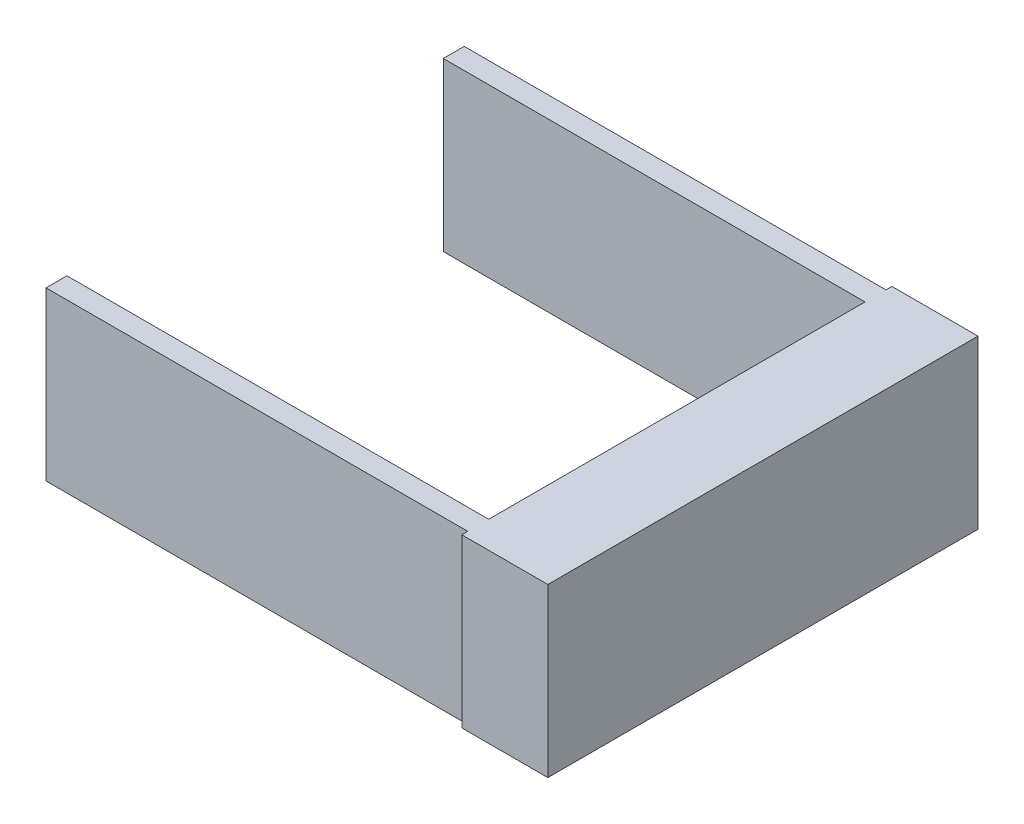
ISO-10303-21;
HEADER;
FILE_DESCRIPTION(('STEP AP214'),'2;1');
FILE_NAME('part.step','',(''),(''),'','','');
FILE_SCHEMA(('AUTOMOTIVE_DESIGN { 1 0 10303 214 1 1 1 1 }'));
ENDSEC;
DATA;
#1=APPLICATION_CONTEXT('core data for automotive mechanical design processes');
#2=APPLICATION_PROTOCOL_DEFINITION('international standard','automotive_design',2000,#1);
#3=PRODUCT_CONTEXT('',#1,'mechanical');
#4=PRODUCT('Part','Part','',(#3));
#5=PRODUCT_RELATED_PRODUCT_CATEGORY('part','',(#4));
#6=PRODUCT_DEFINITION_FORMATION('','',#4);
#7=PRODUCT_DEFINITION_CONTEXT('part definition',#1,'design');
#8=PRODUCT_DEFINITION('design','',#6,#7);
#9=PRODUCT_DEFINITION_SHAPE('','',#8);
#10=(LENGTH_UNIT() NAMED_UNIT(*) SI_UNIT(.MILLI.,.METRE.));
#11=(NAMED_UNIT(*) PLANE_ANGLE_UNIT() SI_UNIT($,.RADIAN.));
#12=(NAMED_UNIT(*) SI_UNIT($,.STERADIAN.) SOLID_ANGLE_UNIT());
#13=UNCERTAINTY_MEASURE_WITH_UNIT(LENGTH_MEASURE(1.E-05),#10,'distance_accuracy_value','');
#14=(GEOMETRIC_REPRESENTATION_CONTEXT(3) GLOBAL_UNCERTAINTY_ASSIGNED_CONTEXT((#13)) GLOBAL_UNIT_ASSIGNED_CONTEXT((#10,
#11,#12)) REPRESENTATION_CONTEXT('',''));
#15=CARTESIAN_POINT('',(0.,0.,0.));
#16=DIRECTION('',(0.,0.,1.));
#17=DIRECTION('',(1.,0.,0.));
#18=AXIS2_PLACEMENT_3D('',#15,#16,#17);
#19=CARTESIAN_POINT('',(0.,28.,35.));
#20=DIRECTION('',(0.,0.,-1.));
#21=DIRECTION('',(-1.,0.,0.));
#22=AXIS2_PLACEMENT_3D('',#19,#20,#21);
#23=PLANE('',#22);
#24=DIRECTION('',(1.,0.,0.));
#25=VECTOR('',#24,1.);
#26=CARTESIAN_POINT('',(0.,0.,35.));
#27=LINE('',#26,#25);
#28=CARTESIAN_POINT('',(-50.,0.,35.));
#29=VERTEX_POINT('',#28);
#30=CARTESIAN_POINT('',(20.5945089595884,0.,35.));
#31=VERTEX_POINT('',#30);
#32=EDGE_CURVE('E158',#29,#31,#27,.T.);
#33=ORIENTED_EDGE('',*,*,#32,.T.);
#34=DIRECTION('',(0.,-1.,0.));
#35=VECTOR('',#34,1.);
#36=CARTESIAN_POINT('',(20.5945089595884,28.,35.));
#37=LINE('',#36,#35);
#38=CARTESIAN_POINT('',(20.5945089595884,28.,35.));
#39=VERTEX_POINT('',#38);
#40=EDGE_CURVE('E11',#39,#31,#37,.T.);
#41=ORIENTED_EDGE('',*,*,#40,.F.);
#42=DIRECTION('',(1.,0.,0.));
#43=VECTOR('',#42,1.);
#44=CARTESIAN_POINT('',(0.,28.,35.));
#45=LINE('',#44,#43);
#46=CARTESIAN_POINT('',(-50.,28.,35.));
#47=VERTEX_POINT('',#46);
#48=EDGE_CURVE('E186',#47,#39,#45,.T.);
#49=ORIENTED_EDGE('',*,*,#48,.F.);
#50=DIRECTION('',(0.,-1.,0.));
#51=VECTOR('',#50,1.);
#52=CARTESIAN_POINT('',(-50.,28.,35.));
#53=LINE('',#52,#51);
#54=EDGE_CURVE('E154',#47,#29,#53,.T.);
#55=ORIENTED_EDGE('',*,*,#54,.T.);
#56=EDGE_LOOP('',(#33,#41,#49,#55));
#57=FACE_BOUND('',#56,.T.);
#58=ADVANCED_FACE('F39',(#57),#23,.F.);
#59=CARTESIAN_POINT('',(20.5945089595884,28.,0.));
#60=DIRECTION('',(1.,0.,0.));
#61=DIRECTION('',(0.,0.,-1.));
#62=AXIS2_PLACEMENT_3D('',#59,#60,#61);
#63=PLANE('',#62);
#64=DIRECTION('',(0.,0.,1.));
#65=VECTOR('',#64,1.);
#66=CARTESIAN_POINT('',(20.5945089595884,0.,0.));
#67=LINE('',#66,#65);
#68=CARTESIAN_POINT('',(20.5945089595884,0.,36.));
#69=VERTEX_POINT('',#68);
#70=EDGE_CURVE('E161',#31,#69,#67,.T.);
#71=ORIENTED_EDGE('',*,*,#70,.T.);
#72=DIRECTION('',(0.,-1.,0.));
#73=VECTOR('',#72,1.);
#74=CARTESIAN_POINT('',(20.5945089595884,28.,36.));
#75=LINE('',#74,#73);
#76=CARTESIAN_POINT('',(20.5945089595884,28.,36.));
#77=VERTEX_POINT('',#76);
#78=EDGE_CURVE('E47',#77,#69,#75,.T.);
#79=ORIENTED_EDGE('',*,*,#78,.F.);
#80=DIRECTION('',(0.,0.,1.));
#81=VECTOR('',#80,1.);
#82=CARTESIAN_POINT('',(20.5945089595884,28.,0.));
#83=LINE('',#82,#81);
#84=EDGE_CURVE('E106',#39,#77,#83,.T.);
#85=ORIENTED_EDGE('',*,*,#84,.F.);
#86=ORIENTED_EDGE('',*,*,#40,.T.);
#87=EDGE_LOOP('',(#71,#79,#85,#86));
#88=FACE_BOUND('',#87,.T.);
#89=ADVANCED_FACE('F209',(#88),#63,.F.);
#90=CARTESIAN_POINT('',(0.,28.,36.));
#91=DIRECTION('',(0.,0.,1.));
#92=DIRECTION('',(1.,0.,0.));
#93=AXIS2_PLACEMENT_3D('',#90,#91,#92);
#94=PLANE('',#93);
#95=DIRECTION('',(-1.,0.,0.));
#96=VECTOR('',#95,1.);
#97=CARTESIAN_POINT('',(0.,0.,36.));
#98=LINE('',#97,#96);
#99=CARTESIAN_POINT('',(35.,0.,36.));
#100=VERTEX_POINT('',#99);
#101=EDGE_CURVE('E164',#100,#69,#98,.T.);
#102=ORIENTED_EDGE('',*,*,#101,.F.);
#103=DIRECTION('',(0.,-1.,0.));
#104=VECTOR('',#103,1.);
#105=CARTESIAN_POINT('',(35.,28.,36.));
#106=LINE('',#105,#104);
#107=CARTESIAN_POINT('',(35.,28.,36.));
#108=VERTEX_POINT('',#107);
#109=EDGE_CURVE('E202',#108,#100,#106,.T.);
#110=ORIENTED_EDGE('',*,*,#109,.F.);
#111=DIRECTION('',(-1.,0.,0.));
#112=VECTOR('',#111,1.);
#113=CARTESIAN_POINT('',(0.,28.,36.));
#114=LINE('',#113,#112);
#115=EDGE_CURVE('E208',#108,#77,#114,.T.);
#116=ORIENTED_EDGE('',*,*,#115,.T.);
#117=ORIENTED_EDGE('',*,*,#78,.T.);
#118=EDGE_LOOP('',(#102,#110,#116,#117));
#119=FACE_BOUND('',#118,.T.);
#120=ADVANCED_FACE('F206',(#119),#94,.T.);
#121=CARTESIAN_POINT('',(35.,28.,0.));
#122=DIRECTION('',(1.,0.,0.));
#123=DIRECTION('',(0.,0.,-1.));
#124=AXIS2_PLACEMENT_3D('',#121,#122,#123);
#125=PLANE('',#124);
#126=DIRECTION('',(0.,0.,1.));
#127=VECTOR('',#126,1.);
#128=CARTESIAN_POINT('',(35.,0.,0.));
#129=LINE('',#128,#127);
#130=CARTESIAN_POINT('',(35.,0.,-36.));
#131=VERTEX_POINT('',#130);
#132=EDGE_CURVE('E167',#131,#100,#129,.T.);
#133=ORIENTED_EDGE('',*,*,#132,.F.);
#134=DIRECTION('',(0.,-1.,0.));
#135=VECTOR('',#134,1.);
#136=CARTESIAN_POINT('',(35.,28.,-36.));
#137=LINE('',#136,#135);
#138=CARTESIAN_POINT('',(35.,28.,-36.));
#139=VERTEX_POINT('',#138);
#140=EDGE_CURVE('E200',#139,#131,#137,.T.);
#141=ORIENTED_EDGE('',*,*,#140,.F.);
#142=DIRECTION('',(0.,0.,1.));
#143=VECTOR('',#142,1.);
#144=CARTESIAN_POINT('',(35.,28.,0.));
#145=LINE('',#144,#143);
#146=EDGE_CURVE('E222',#139,#108,#145,.T.);
#147=ORIENTED_EDGE('',*,*,#146,.T.);
#148=ORIENTED_EDGE('',*,*,#109,.T.);
#149=EDGE_LOOP('',(#133,#141,#147,#148));
#150=FACE_BOUND('',#149,.T.);
#151=ADVANCED_FACE('F218',(#150),#125,.T.);
#152=CARTESIAN_POINT('',(0.,28.,-36.));
#153=DIRECTION('',(0.,0.,1.));
#154=DIRECTION('',(1.,0.,0.));
#155=AXIS2_PLACEMENT_3D('',#152,#153,#154);
#156=PLANE('',#155);
#157=DIRECTION('',(-1.,0.,0.));
#158=VECTOR('',#157,1.);
#159=CARTESIAN_POINT('',(0.,0.,-36.));
#160=LINE('',#159,#158);
#161=CARTESIAN_POINT('',(20.5945089595884,0.,-36.));
#162=VERTEX_POINT('',#161);
#163=EDGE_CURVE('E170',#131,#162,#160,.T.);
#164=ORIENTED_EDGE('',*,*,#163,.T.);
#165=DIRECTION('',(0.,-1.,0.));
#166=VECTOR('',#165,1.);
#167=CARTESIAN_POINT('',(20.5945089595884,28.,-36.));
#168=LINE('',#167,#166);
#169=CARTESIAN_POINT('',(20.5945089595884,28.,-36.));
#170=VERTEX_POINT('',#169);
#171=EDGE_CURVE('E197',#170,#162,#168,.T.);
#172=ORIENTED_EDGE('',*,*,#171,.F.);
#173=DIRECTION('',(-1.,0.,0.));
#174=VECTOR('',#173,1.);
#175=CARTESIAN_POINT('',(0.,28.,-36.));
#176=LINE('',#175,#174);
#177=EDGE_CURVE('E224',#139,#170,#176,.T.);
#178=ORIENTED_EDGE('',*,*,#177,.F.);
#179=ORIENTED_EDGE('',*,*,#140,.T.);
#180=EDGE_LOOP('',(#164,#172,#178,#179));
#181=FACE_BOUND('',#180,.T.);
#182=ADVANCED_FACE('F268',(#181),#156,.F.);
#183=CARTESIAN_POINT('',(20.5945089595832,28.,3.00096536614594E-12));
#184=DIRECTION('',(1.,0.,1.45716771982054E-13));
#185=DIRECTION('',(1.45716771982054E-13,0.,-1.));
#186=AXIS2_PLACEMENT_3D('',#183,#184,#185);
#187=PLANE('',#186);
#188=DIRECTION('',(-1.45716771982054E-13,0.,1.));
#189=VECTOR('',#188,1.);
#190=CARTESIAN_POINT('',(20.5945089595832,0.,3.00096536614594E-12));
#191=LINE('',#190,#189);
#192=CARTESIAN_POINT('',(20.5945089595883,0.,-35.));
#193=VERTEX_POINT('',#192);
#194=EDGE_CURVE('E172',#162,#193,#191,.T.);
#195=ORIENTED_EDGE('',*,*,#194,.T.);
#196=DIRECTION('',(0.,-1.,0.));
#197=VECTOR('',#196,1.);
#198=CARTESIAN_POINT('',(20.5945089595883,28.,-35.));
#199=LINE('',#198,#197);
#200=CARTESIAN_POINT('',(20.5945089595883,28.,-35.));
#201=VERTEX_POINT('',#200);
#202=EDGE_CURVE('E195',#201,#193,#199,.T.);
#203=ORIENTED_EDGE('',*,*,#202,.F.);
#204=DIRECTION('',(-1.45716771982054E-13,0.,1.));
#205=VECTOR('',#204,1.);
#206=CARTESIAN_POINT('',(20.5945089595832,28.,3.00096536614594E-12));
#207=LINE('',#206,#205);
#208=EDGE_CURVE('E230',#170,#201,#207,.T.);
#209=ORIENTED_EDGE('',*,*,#208,.F.);
#210=ORIENTED_EDGE('',*,*,#171,.T.);
#211=EDGE_LOOP('',(#195,#203,#209,#210));
#212=FACE_BOUND('',#211,.T.);
#213=ADVANCED_FACE('F271',(#212),#187,.F.);
#214=CARTESIAN_POINT('',(0.,28.,-35.));
#215=DIRECTION('',(0.,0.,-1.));
#216=DIRECTION('',(-1.,0.,0.));
#217=AXIS2_PLACEMENT_3D('',#214,#215,#216);
#218=PLANE('',#217);
#219=DIRECTION('',(1.,0.,0.));
#220=VECTOR('',#219,1.);
#221=CARTESIAN_POINT('',(0.,0.,-35.));
#222=LINE('',#221,#220);
#223=CARTESIAN_POINT('',(-50.,0.,-35.));
#224=VERTEX_POINT('',#223);
#225=EDGE_CURVE('E175',#224,#193,#222,.T.);
#226=ORIENTED_EDGE('',*,*,#225,.F.);
#227=DIRECTION('',(0.,-1.,0.));
#228=VECTOR('',#227,1.);
#229=CARTESIAN_POINT('',(-50.,28.,-35.));
#230=LINE('',#229,#228);
#231=CARTESIAN_POINT('',(-50.,28.,-35.));
#232=VERTEX_POINT('',#231);
#233=EDGE_CURVE('E193',#232,#224,#230,.T.);
#234=ORIENTED_EDGE('',*,*,#233,.F.);
#235=DIRECTION('',(1.,0.,0.));
#236=VECTOR('',#235,1.);
#237=CARTESIAN_POINT('',(0.,28.,-35.));
#238=LINE('',#237,#236);
#239=EDGE_CURVE('E232',#232,#201,#238,.T.);
#240=ORIENTED_EDGE('',*,*,#239,.T.);
#241=ORIENTED_EDGE('',*,*,#202,.T.);
#242=EDGE_LOOP('',(#226,#234,#240,#241));
#243=FACE_BOUND('',#242,.T.);
#244=ADVANCED_FACE('F275',(#243),#218,.T.);
#245=CARTESIAN_POINT('',(-50.,28.,0.));
#246=DIRECTION('',(1.,0.,0.));
#247=DIRECTION('',(0.,0.,-1.));
#248=AXIS2_PLACEMENT_3D('',#245,#246,#247);
#249=PLANE('',#248);
#250=DIRECTION('',(0.,0.,1.));
#251=VECTOR('',#250,1.);
#252=CARTESIAN_POINT('',(-50.,0.,0.));
#253=LINE('',#252,#251);
#254=CARTESIAN_POINT('',(-50.,0.,-31.5));
#255=VERTEX_POINT('',#254);
#256=EDGE_CURVE('E178',#224,#255,#253,.T.);
#257=ORIENTED_EDGE('',*,*,#256,.T.);
#258=DIRECTION('',(0.,-1.,0.));
#259=VECTOR('',#258,1.);
#260=CARTESIAN_POINT('',(-50.,28.,-31.5));
#261=LINE('',#260,#259);
#262=CARTESIAN_POINT('',(-50.,28.,-31.5));
#263=VERTEX_POINT('',#262);
#264=EDGE_CURVE('E190',#263,#255,#261,.T.);
#265=ORIENTED_EDGE('',*,*,#264,.F.);
#266=DIRECTION('',(0.,0.,1.));
#267=VECTOR('',#266,1.);
#268=CARTESIAN_POINT('',(-50.,28.,0.));
#269=LINE('',#268,#267);
#270=EDGE_CURVE('E235',#232,#263,#269,.T.);
#271=ORIENTED_EDGE('',*,*,#270,.F.);
#272=ORIENTED_EDGE('',*,*,#233,.T.);
#273=EDGE_LOOP('',(#257,#265,#271,#272));
#274=FACE_BOUND('',#273,.T.);
#275=ADVANCED_FACE('F240',(#274),#249,.F.);
#276=CARTESIAN_POINT('',(0.,28.,-31.5));
#277=DIRECTION('',(0.,0.,-1.));
#278=DIRECTION('',(-1.,0.,0.));
#279=AXIS2_PLACEMENT_3D('',#276,#277,#278);
#280=PLANE('',#279);
#281=DIRECTION('',(1.,0.,0.));
#282=VECTOR('',#281,1.);
#283=CARTESIAN_POINT('',(0.,0.,-31.5));
#284=LINE('',#283,#282);
#285=CARTESIAN_POINT('',(20.5945089595883,0.,-31.5));
#286=VERTEX_POINT('',#285);
#287=EDGE_CURVE('E180',#255,#286,#284,.T.);
#288=ORIENTED_EDGE('',*,*,#287,.T.);
#289=DIRECTION('',(0.,-1.,0.));
#290=VECTOR('',#289,1.);
#291=CARTESIAN_POINT('',(20.5945089595883,28.,-31.5));
#292=LINE('',#291,#290);
#293=CARTESIAN_POINT('',(20.5945089595883,28.,-31.5));
#294=VERTEX_POINT('',#293);
#295=EDGE_CURVE('E150',#294,#286,#292,.T.);
#296=ORIENTED_EDGE('',*,*,#295,.F.);
#297=DIRECTION('',(1.,0.,0.));
#298=VECTOR('',#297,1.);
#299=CARTESIAN_POINT('',(0.,28.,-31.5));
#300=LINE('',#299,#298);
#301=EDGE_CURVE('E137',#263,#294,#300,.T.);
#302=ORIENTED_EDGE('',*,*,#301,.F.);
#303=ORIENTED_EDGE('',*,*,#264,.T.);
#304=EDGE_LOOP('',(#288,#296,#302,#303));
#305=FACE_BOUND('',#304,.T.);
#306=ADVANCED_FACE('F244',(#305),#280,.F.);
#307=CARTESIAN_POINT('',(20.5945089595884,28.,0.));
#308=DIRECTION('',(1.,0.,0.));
#309=DIRECTION('',(0.,0.,-1.));
#310=AXIS2_PLACEMENT_3D('',#307,#308,#309);
#311=PLANE('',#310);
#312=DIRECTION('',(0.,0.,1.));
#313=VECTOR('',#312,1.);
#314=CARTESIAN_POINT('',(20.5945089595884,0.,0.));
#315=LINE('',#314,#313);
#316=CARTESIAN_POINT('',(20.5945089595884,0.,31.5));
#317=VERTEX_POINT('',#316);
#318=EDGE_CURVE('E146',#286,#317,#315,.T.);
#319=ORIENTED_EDGE('',*,*,#318,.T.);
#320=DIRECTION('',(0.,-1.,0.));
#321=VECTOR('',#320,1.);
#322=CARTESIAN_POINT('',(20.5945089595884,28.,31.5));
#323=LINE('',#322,#321);
#324=CARTESIAN_POINT('',(20.5945089595884,28.,31.5));
#325=VERTEX_POINT('',#324);
#326=EDGE_CURVE('E143',#325,#317,#323,.T.);
#327=ORIENTED_EDGE('',*,*,#326,.F.);
#328=DIRECTION('',(0.,0.,1.));
#329=VECTOR('',#328,1.);
#330=CARTESIAN_POINT('',(20.5945089595884,28.,0.));
#331=LINE('',#330,#329);
#332=EDGE_CURVE('E131',#294,#325,#331,.T.);
#333=ORIENTED_EDGE('',*,*,#332,.F.);
#334=ORIENTED_EDGE('',*,*,#295,.T.);
#335=EDGE_LOOP('',(#319,#327,#333,#334));
#336=FACE_BOUND('',#335,.T.);
#337=ADVANCED_FACE('F144',(#336),#311,.F.);
#338=CARTESIAN_POINT('',(0.,28.,31.5));
#339=DIRECTION('',(0.,0.,-1.));
#340=DIRECTION('',(-1.,0.,0.));
#341=AXIS2_PLACEMENT_3D('',#338,#339,#340);
#342=PLANE('',#341);
#343=DIRECTION('',(1.,0.,0.));
#344=VECTOR('',#343,1.);
#345=CARTESIAN_POINT('',(0.,0.,31.5));
#346=LINE('',#345,#344);
#347=CARTESIAN_POINT('',(-50.,0.,31.5));
#348=VERTEX_POINT('',#347);
#349=EDGE_CURVE('E183',#348,#317,#346,.T.);
#350=ORIENTED_EDGE('',*,*,#349,.F.);
#351=DIRECTION('',(0.,-1.,0.));
#352=VECTOR('',#351,1.);
#353=CARTESIAN_POINT('',(-50.,28.,31.5));
#354=LINE('',#353,#352);
#355=CARTESIAN_POINT('',(-50.,28.,31.5));
#356=VERTEX_POINT('',#355);
#357=EDGE_CURVE('E95',#356,#348,#354,.T.);
#358=ORIENTED_EDGE('',*,*,#357,.F.);
#359=DIRECTION('',(1.,0.,0.));
#360=VECTOR('',#359,1.);
#361=CARTESIAN_POINT('',(0.,28.,31.5));
#362=LINE('',#361,#360);
#363=EDGE_CURVE('E135',#356,#325,#362,.T.);
#364=ORIENTED_EDGE('',*,*,#363,.T.);
#365=ORIENTED_EDGE('',*,*,#326,.T.);
#366=EDGE_LOOP('',(#350,#358,#364,#365));
#367=FACE_BOUND('',#366,.T.);
#368=ADVANCED_FACE('F152',(#367),#342,.T.);
#369=CARTESIAN_POINT('',(-50.,28.,0.));
#370=DIRECTION('',(1.,0.,0.));
#371=DIRECTION('',(0.,0.,-1.));
#372=AXIS2_PLACEMENT_3D('',#369,#370,#371);
#373=PLANE('',#372);
#374=DIRECTION('',(0.,0.,1.));
#375=VECTOR('',#374,1.);
#376=CARTESIAN_POINT('',(-50.,0.,0.));
#377=LINE('',#376,#375);
#378=EDGE_CURVE('E98',#348,#29,#377,.T.);
#379=ORIENTED_EDGE('',*,*,#378,.T.);
#380=ORIENTED_EDGE('',*,*,#54,.F.);
#381=DIRECTION('',(0.,0.,1.));
#382=VECTOR('',#381,1.);
#383=CARTESIAN_POINT('',(-50.,28.,0.));
#384=LINE('',#383,#382);
#385=EDGE_CURVE('E55',#356,#47,#384,.T.);
#386=ORIENTED_EDGE('',*,*,#385,.F.);
#387=ORIENTED_EDGE('',*,*,#357,.T.);
#388=EDGE_LOOP('',(#379,#380,#386,#387));
#389=FACE_BOUND('',#388,.T.);
#390=ADVANCED_FACE('F247',(#389),#373,.F.);
#391=CARTESIAN_POINT('',(0.,28.,0.));
#392=DIRECTION('',(0.,1.,0.));
#393=DIRECTION('',(0.,0.,1.));
#394=AXIS2_PLACEMENT_3D('',#391,#392,#393);
#395=PLANE('',#394);
#396=ORIENTED_EDGE('',*,*,#48,.T.);
#397=ORIENTED_EDGE('',*,*,#84,.T.);
#398=ORIENTED_EDGE('',*,*,#115,.F.);
#399=ORIENTED_EDGE('',*,*,#146,.F.);
#400=ORIENTED_EDGE('',*,*,#177,.T.);
#401=ORIENTED_EDGE('',*,*,#208,.T.);
#402=ORIENTED_EDGE('',*,*,#239,.F.);
#403=ORIENTED_EDGE('',*,*,#270,.T.);
#404=ORIENTED_EDGE('',*,*,#301,.T.);
#405=ORIENTED_EDGE('',*,*,#332,.T.);
#406=ORIENTED_EDGE('',*,*,#363,.F.);
#407=ORIENTED_EDGE('',*,*,#385,.T.);
#408=EDGE_LOOP('',(#396,#397,#398,#399,#400,#401,#402,#403,#404,#405,#406,#407));
#409=FACE_BOUND('',#408,.T.);
#410=ADVANCED_FACE('F133',(#409),#395,.T.);
#411=CARTESIAN_POINT('',(0.,0.,0.));
#412=DIRECTION('',(0.,1.,0.));
#413=DIRECTION('',(0.,0.,1.));
#414=AXIS2_PLACEMENT_3D('',#411,#412,#413);
#415=PLANE('',#414);
#416=ORIENTED_EDGE('',*,*,#32,.F.);
#417=ORIENTED_EDGE('',*,*,#378,.F.);
#418=ORIENTED_EDGE('',*,*,#349,.T.);
#419=ORIENTED_EDGE('',*,*,#318,.F.);
#420=ORIENTED_EDGE('',*,*,#287,.F.);
#421=ORIENTED_EDGE('',*,*,#256,.F.);
#422=ORIENTED_EDGE('',*,*,#225,.T.);
#423=ORIENTED_EDGE('',*,*,#194,.F.);
#424=ORIENTED_EDGE('',*,*,#163,.F.);
#425=ORIENTED_EDGE('',*,*,#132,.T.);
#426=ORIENTED_EDGE('',*,*,#101,.T.);
#427=ORIENTED_EDGE('',*,*,#70,.F.);
#428=EDGE_LOOP('',(#416,#417,#418,#419,#420,#421,#422,#423,#424,#425,#426,#427));
#429=FACE_BOUND('',#428,.T.);
#430=ADVANCED_FACE('F213',(#429),#415,.F.);
#431=CLOSED_SHELL('',(#58,#89,#120,#151,#182,#213,#244,#275,#306,#337,#368,#390,#410,#430));
#432=MANIFOLD_SOLID_BREP('B2',#431);
#433=ADVANCED_BREP_SHAPE_REPRESENTATION('',(#18,#432),#14);
#434=SHAPE_DEFINITION_REPRESENTATION(#9,#433);
ENDSEC;
END-ISO-10303-21;
